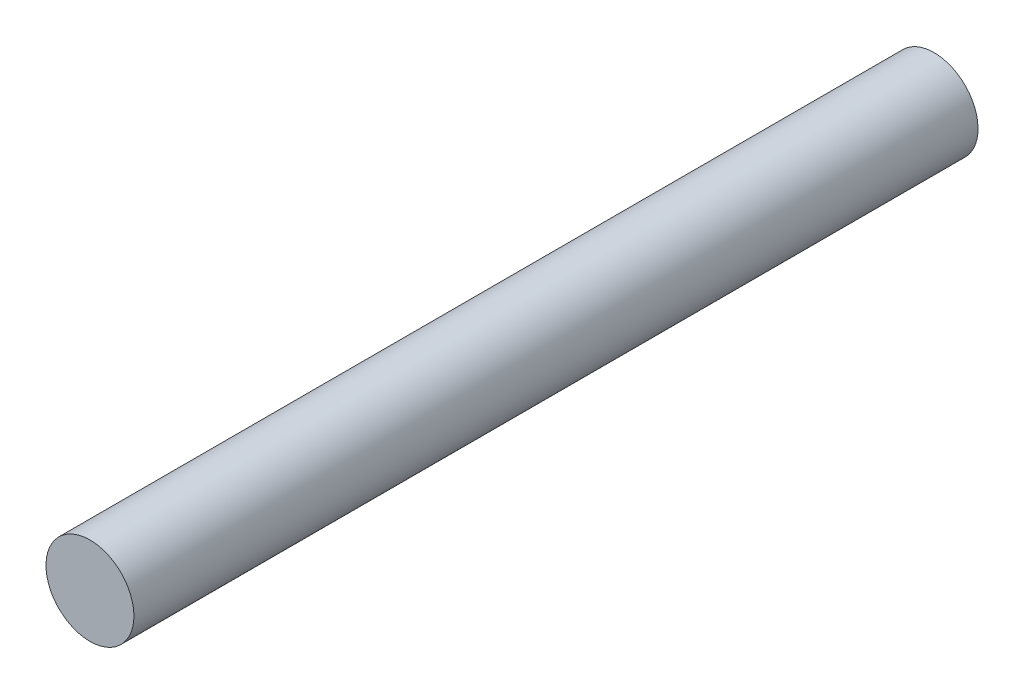
ISO-10303-21;
HEADER;
FILE_DESCRIPTION(('STEP AP214'),'2;1');
FILE_NAME('part.step','',(''),(''),'','','');
FILE_SCHEMA(('AUTOMOTIVE_DESIGN { 1 0 10303 214 1 1 1 1 }'));
ENDSEC;
DATA;
#1=APPLICATION_CONTEXT('core data for automotive mechanical design processes');
#2=APPLICATION_PROTOCOL_DEFINITION('international standard','automotive_design',2000,#1);
#3=PRODUCT_CONTEXT('',#1,'mechanical');
#4=PRODUCT('Part','Part','',(#3));
#5=PRODUCT_RELATED_PRODUCT_CATEGORY('part','',(#4));
#6=PRODUCT_DEFINITION_FORMATION('','',#4);
#7=PRODUCT_DEFINITION_CONTEXT('part definition',#1,'design');
#8=PRODUCT_DEFINITION('design','',#6,#7);
#9=PRODUCT_DEFINITION_SHAPE('','',#8);
#10=(LENGTH_UNIT() NAMED_UNIT(*) SI_UNIT(.MILLI.,.METRE.));
#11=(NAMED_UNIT(*) PLANE_ANGLE_UNIT() SI_UNIT($,.RADIAN.));
#12=(NAMED_UNIT(*) SI_UNIT($,.STERADIAN.) SOLID_ANGLE_UNIT());
#13=UNCERTAINTY_MEASURE_WITH_UNIT(LENGTH_MEASURE(1.E-05),#10,'distance_accuracy_value','');
#14=(GEOMETRIC_REPRESENTATION_CONTEXT(3) GLOBAL_UNCERTAINTY_ASSIGNED_CONTEXT((#13)) GLOBAL_UNIT_ASSIGNED_CONTEXT((#10,
#11,#12)) REPRESENTATION_CONTEXT('',''));
#15=CARTESIAN_POINT('',(0.,0.,0.));
#16=DIRECTION('',(0.,0.,1.));
#17=DIRECTION('',(1.,0.,0.));
#18=AXIS2_PLACEMENT_3D('',#15,#16,#17);
#19=CARTESIAN_POINT('',(-336.630321098568,35.6752077262616,4.31799999999966));
#20=DIRECTION('',(0.,0.,1.));
#21=DIRECTION('',(0.,-1.,0.));
#22=AXIS2_PLACEMENT_3D('',#19,#20,#21);
#23=CYLINDRICAL_SURFACE('',#22,19.05);
#24=CARTESIAN_POINT('',(-336.630321098568,35.6752077262616,4.31799999999966));
#25=DIRECTION('',(0.,0.,-1.));
#26=DIRECTION('',(0.,1.,0.));
#27=AXIS2_PLACEMENT_3D('',#24,#25,#26);
#28=CIRCLE('',#27,19.05);
#29=CARTESIAN_POINT('',(-336.630321098568,16.6252077262615,4.31799999999966));
#30=VERTEX_POINT('',#29);
#31=EDGE_CURVE('E10',#30,#30,#28,.T.);
#32=CARTESIAN_POINT('',(-336.630321098568,35.6752077262616,370.078));
#33=DIRECTION('',(0.,0.,-1.));
#34=DIRECTION('',(0.,1.,0.));
#35=AXIS2_PLACEMENT_3D('',#32,#33,#34);
#36=CIRCLE('',#35,19.05);
#37=CARTESIAN_POINT('',(-336.630321098568,16.6252077262616,370.078));
#38=VERTEX_POINT('',#37);
#39=EDGE_CURVE('E35',#38,#38,#36,.T.);
#40=CARTESIAN_POINT('',(-336.630321098568,16.6252077262615,4.31799999999966));
#41=CARTESIAN_POINT('',(-336.630321098568,16.6252077262615,8.12799999999966));
#42=CARTESIAN_POINT('',(-336.630321098568,16.6252077262615,11.9379999999997));
#43=CARTESIAN_POINT('',(-336.630321098568,16.6252077262615,19.5579999999997));
#44=CARTESIAN_POINT('',(-336.630321098568,16.6252077262615,23.3679999999997));
#45=CARTESIAN_POINT('',(-336.630321098568,16.6252077262615,30.9879999999997));
#46=CARTESIAN_POINT('',(-336.630321098568,16.6252077262615,34.7979999999997));
#47=CARTESIAN_POINT('',(-336.630321098568,16.6252077262615,42.4179999999997));
#48=CARTESIAN_POINT('',(-336.630321098568,16.6252077262615,46.2279999999997));
#49=CARTESIAN_POINT('',(-336.630321098568,16.6252077262615,53.8479999999997));
#50=CARTESIAN_POINT('',(-336.630321098568,16.6252077262615,57.6579999999997));
#51=CARTESIAN_POINT('',(-336.630321098568,16.6252077262615,65.2779999999997));
#52=CARTESIAN_POINT('',(-336.630321098568,16.6252077262615,69.0879999999997));
#53=CARTESIAN_POINT('',(-336.630321098568,16.6252077262615,76.7079999999997));
#54=CARTESIAN_POINT('',(-336.630321098568,16.6252077262615,80.5179999999997));
#55=CARTESIAN_POINT('',(-336.630321098568,16.6252077262615,88.1379999999997));
#56=CARTESIAN_POINT('',(-336.630321098568,16.6252077262615,91.9479999999997));
#57=CARTESIAN_POINT('',(-336.630321098568,16.6252077262615,99.5679999999997));
#58=CARTESIAN_POINT('',(-336.630321098568,16.6252077262615,103.378));
#59=CARTESIAN_POINT('',(-336.630321098568,16.6252077262615,110.998));
#60=CARTESIAN_POINT('',(-336.630321098568,16.6252077262615,114.808));
#61=CARTESIAN_POINT('',(-336.630321098568,16.6252077262615,122.428));
#62=CARTESIAN_POINT('',(-336.630321098568,16.6252077262615,126.238));
#63=CARTESIAN_POINT('',(-336.630321098568,16.6252077262615,133.858));
#64=CARTESIAN_POINT('',(-336.630321098568,16.6252077262615,137.668));
#65=CARTESIAN_POINT('',(-336.630321098568,16.6252077262615,145.288));
#66=CARTESIAN_POINT('',(-336.630321098568,16.6252077262615,149.098));
#67=CARTESIAN_POINT('',(-336.630321098568,16.6252077262615,156.718));
#68=CARTESIAN_POINT('',(-336.630321098568,16.6252077262616,160.528));
#69=CARTESIAN_POINT('',(-336.630321098568,16.6252077262616,168.148));
#70=CARTESIAN_POINT('',(-336.630321098568,16.6252077262616,171.958));
#71=CARTESIAN_POINT('',(-336.630321098568,16.6252077262616,179.578));
#72=CARTESIAN_POINT('',(-336.630321098568,16.6252077262616,183.388));
#73=CARTESIAN_POINT('',(-336.630321098568,16.6252077262616,191.008));
#74=CARTESIAN_POINT('',(-336.630321098568,16.6252077262616,194.818));
#75=CARTESIAN_POINT('',(-336.630321098568,16.6252077262616,202.438));
#76=CARTESIAN_POINT('',(-336.630321098568,16.6252077262616,206.248));
#77=CARTESIAN_POINT('',(-336.630321098568,16.6252077262616,213.868));
#78=CARTESIAN_POINT('',(-336.630321098568,16.6252077262616,217.678));
#79=CARTESIAN_POINT('',(-336.630321098568,16.6252077262616,225.298));
#80=CARTESIAN_POINT('',(-336.630321098568,16.6252077262616,229.108));
#81=CARTESIAN_POINT('',(-336.630321098568,16.6252077262616,236.728));
#82=CARTESIAN_POINT('',(-336.630321098568,16.6252077262616,240.538));
#83=CARTESIAN_POINT('',(-336.630321098568,16.6252077262616,248.158));
#84=CARTESIAN_POINT('',(-336.630321098568,16.6252077262616,251.968));
#85=CARTESIAN_POINT('',(-336.630321098568,16.6252077262616,259.588));
#86=CARTESIAN_POINT('',(-336.630321098568,16.6252077262616,263.398));
#87=CARTESIAN_POINT('',(-336.630321098568,16.6252077262616,271.018));
#88=CARTESIAN_POINT('',(-336.630321098568,16.6252077262616,274.828));
#89=CARTESIAN_POINT('',(-336.630321098568,16.6252077262616,282.448));
#90=CARTESIAN_POINT('',(-336.630321098568,16.6252077262616,286.258));
#91=CARTESIAN_POINT('',(-336.630321098568,16.6252077262616,293.878));
#92=CARTESIAN_POINT('',(-336.630321098568,16.6252077262616,297.688));
#93=CARTESIAN_POINT('',(-336.630321098568,16.6252077262616,305.308));
#94=CARTESIAN_POINT('',(-336.630321098568,16.6252077262616,309.118));
#95=CARTESIAN_POINT('',(-336.630321098568,16.6252077262616,316.738));
#96=CARTESIAN_POINT('',(-336.630321098568,16.6252077262616,320.548));
#97=CARTESIAN_POINT('',(-336.630321098568,16.6252077262616,328.168));
#98=CARTESIAN_POINT('',(-336.630321098568,16.6252077262616,331.978));
#99=CARTESIAN_POINT('',(-336.630321098568,16.6252077262616,339.598));
#100=CARTESIAN_POINT('',(-336.630321098568,16.6252077262616,343.408));
#101=CARTESIAN_POINT('',(-336.630321098568,16.6252077262616,351.028));
#102=CARTESIAN_POINT('',(-336.630321098568,16.6252077262616,354.838));
#103=CARTESIAN_POINT('',(-336.630321098568,16.6252077262616,362.458));
#104=CARTESIAN_POINT('',(-336.630321098568,16.6252077262616,366.268));
#105=CARTESIAN_POINT('',(-336.630321098568,16.6252077262616,370.078));
#106=B_SPLINE_CURVE_WITH_KNOTS('',3,(#40,#41,#42,#43,#44,#45,#46,#47,#48,#49,#50,#51,#52,#53,
#54,#55,#56,#57,#58,#59,#60,#61,#62,#63,#64,#65,#66,#67,#68,#69,#70,#71,#72,#73,#74,#75,#76,#77,
#78,#79,#80,#81,#82,#83,#84,#85,#86,#87,#88,#89,#90,#91,#92,#93,#94,#95,#96,#97,#98,#99,#100,
#101,#102,#103,#104,#105),.UNSPECIFIED.,.F.,.F.,(4,2,2,2,2,2,2,2,2,2,2,2,2,2,2,2,2,2,2,2,2,2,2,
2,2,2,2,2,2,2,2,2,4),(0.,11.43,22.86,34.29,45.72,57.15,68.58,80.01,91.44,102.87,114.3,125.73,
137.16,148.59,160.02,171.45,182.88,194.31,205.74,217.17,228.6,240.03,251.46,262.89,274.32,
285.75,297.18,308.61,320.04,331.47,342.9,354.33,365.76),.UNSPECIFIED.);
#107=EDGE_CURVE('BSEAM32',#30,#38,#106,.T.);
#108=ORIENTED_EDGE('',*,*,#31,.F.);
#109=ORIENTED_EDGE('',*,*,#39,.T.);
#110=ORIENTED_EDGE('',*,*,#107,.T.);
#111=ORIENTED_EDGE('',*,*,#107,.F.);
#112=EDGE_LOOP('',(#108,#110,#109,#111));
#113=FACE_BOUND('',#112,.T.);
#114=ADVANCED_FACE('F32',(#113),#23,.T.);
#115=CARTESIAN_POINT('',(-336.630321098568,35.6752077262616,4.31799999999966));
#116=DIRECTION('',(0.,0.,-1.));
#117=DIRECTION('',(0.,1.,0.));
#118=AXIS2_PLACEMENT_3D('',#115,#116,#117);
#119=PLANE('',#118);
#120=ORIENTED_EDGE('',*,*,#31,.T.);
#121=EDGE_LOOP('',(#120));
#122=FACE_BOUND('',#121,.T.);
#123=ADVANCED_FACE('F47',(#122),#119,.T.);
#124=CARTESIAN_POINT('',(-336.630321098568,35.6752077262616,370.078));
#125=DIRECTION('',(0.,0.,-1.));
#126=DIRECTION('',(0.,1.,0.));
#127=AXIS2_PLACEMENT_3D('',#124,#125,#126);
#128=PLANE('',#127);
#129=ORIENTED_EDGE('',*,*,#39,.F.);
#130=EDGE_LOOP('',(#129));
#131=FACE_BOUND('',#130,.T.);
#132=ADVANCED_FACE('F45',(#131),#128,.F.);
#133=CLOSED_SHELL('',(#114,#123,#132));
#134=MANIFOLD_SOLID_BREP('B2',#133);
#135=ADVANCED_BREP_SHAPE_REPRESENTATION('',(#18,#134),#14);
#136=SHAPE_DEFINITION_REPRESENTATION(#9,#135);
ENDSEC;
END-ISO-10303-21;
